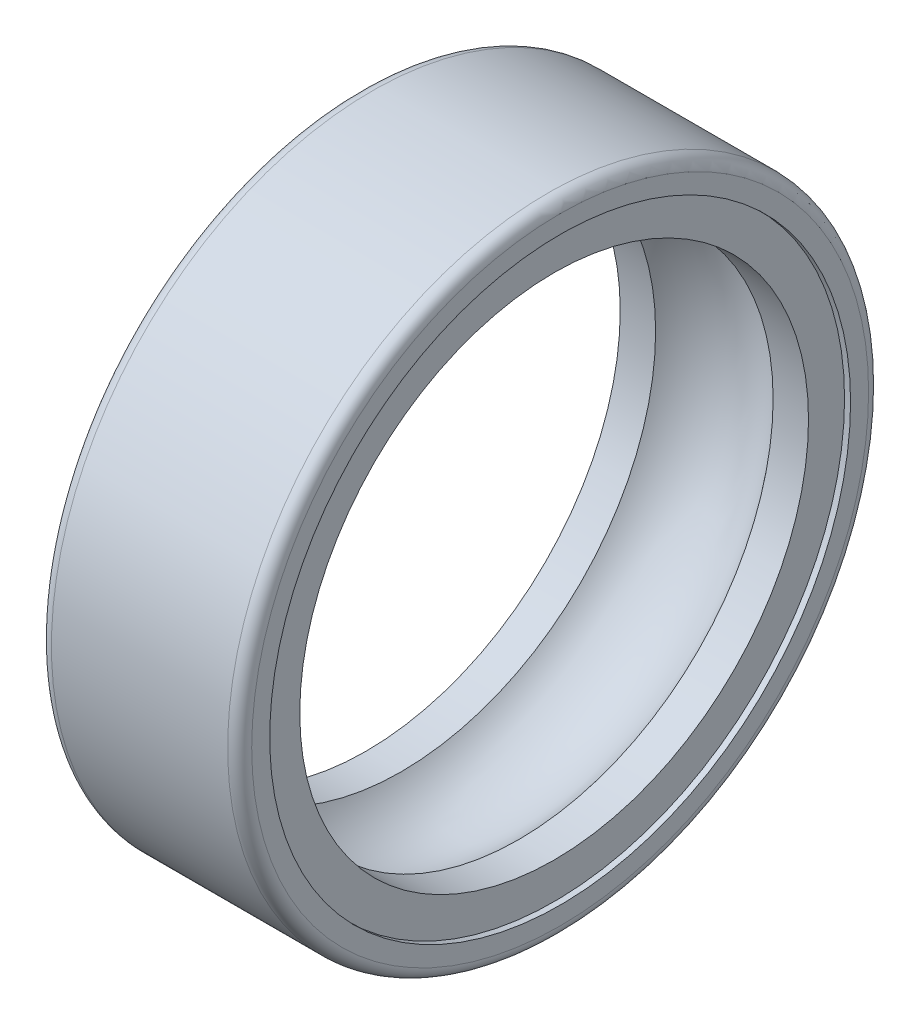
ISO-10303-21;
HEADER;
FILE_DESCRIPTION(('STEP AP214'),'2;1');
FILE_NAME('part.step','',(''),(''),'','','');
FILE_SCHEMA(('AUTOMOTIVE_DESIGN { 1 0 10303 214 1 1 1 1 }'));
ENDSEC;
DATA;
#1=APPLICATION_CONTEXT('core data for automotive mechanical design processes');
#2=APPLICATION_PROTOCOL_DEFINITION('international standard','automotive_design',2000,#1);
#3=PRODUCT_CONTEXT('',#1,'mechanical');
#4=PRODUCT('Part','Part','',(#3));
#5=PRODUCT_RELATED_PRODUCT_CATEGORY('part','',(#4));
#6=PRODUCT_DEFINITION_FORMATION('','',#4);
#7=PRODUCT_DEFINITION_CONTEXT('part definition',#1,'design');
#8=PRODUCT_DEFINITION('design','',#6,#7);
#9=PRODUCT_DEFINITION_SHAPE('','',#8);
#10=(LENGTH_UNIT() NAMED_UNIT(*) SI_UNIT(.MILLI.,.METRE.));
#11=(NAMED_UNIT(*) PLANE_ANGLE_UNIT() SI_UNIT($,.RADIAN.));
#12=(NAMED_UNIT(*) SI_UNIT($,.STERADIAN.) SOLID_ANGLE_UNIT());
#13=UNCERTAINTY_MEASURE_WITH_UNIT(LENGTH_MEASURE(1.E-05),#10,'distance_accuracy_value','');
#14=(GEOMETRIC_REPRESENTATION_CONTEXT(3) GLOBAL_UNCERTAINTY_ASSIGNED_CONTEXT((#13)) GLOBAL_UNIT_ASSIGNED_CONTEXT((#10,
#11,#12)) REPRESENTATION_CONTEXT('',''));
#15=CARTESIAN_POINT('',(0.,0.,0.));
#16=DIRECTION('',(0.,0.,1.));
#17=DIRECTION('',(1.,0.,0.));
#18=AXIS2_PLACEMENT_3D('',#15,#16,#17);
#19=CARTESIAN_POINT('',(-2.2,0.,0.));
#20=DIRECTION('',(1.,0.,0.));
#21=DIRECTION('',(0.,0.,-1.));
#22=AXIS2_PLACEMENT_3D('',#19,#20,#21);
#23=TOROIDAL_SURFACE('',#22,7.7,0.3);
#24=CARTESIAN_POINT('',(-2.5,0.,0.));
#25=DIRECTION('',(-1.,0.,0.));
#26=DIRECTION('',(0.,0.,-1.));
#27=AXIS2_PLACEMENT_3D('',#24,#25,#26);
#28=CIRCLE('',#27,7.7);
#29=CARTESIAN_POINT('',(-2.5,0.,-7.7));
#30=VERTEX_POINT('',#29);
#31=EDGE_CURVE('E31',#30,#30,#28,.T.);
#32=ORIENTED_EDGE('',*,*,#31,.F.);
#33=EDGE_LOOP('',(#32));
#34=FACE_BOUND('',#33,.T.);
#35=CARTESIAN_POINT('',(-2.2,0.,0.));
#36=DIRECTION('',(-1.,0.,0.));
#37=DIRECTION('',(0.,0.,-1.));
#38=AXIS2_PLACEMENT_3D('',#35,#36,#37);
#39=CIRCLE('',#38,8.);
#40=CARTESIAN_POINT('',(-2.2,0.,-8.));
#41=VERTEX_POINT('',#40);
#42=EDGE_CURVE('E10',#41,#41,#39,.T.);
#43=ORIENTED_EDGE('',*,*,#42,.T.);
#44=EDGE_LOOP('',(#43));
#45=FACE_BOUND('',#44,.T.);
#46=ADVANCED_FACE('F15',(#34,#45),#23,.T.);
#47=CARTESIAN_POINT('',(0.,0.,0.));
#48=DIRECTION('',(-1.,0.,0.));
#49=DIRECTION('',(0.,1.,0.));
#50=AXIS2_PLACEMENT_3D('',#47,#48,#49);
#51=CYLINDRICAL_SURFACE('',#50,8.);
#52=ORIENTED_EDGE('',*,*,#42,.F.);
#53=EDGE_LOOP('',(#52));
#54=FACE_BOUND('',#53,.T.);
#55=CARTESIAN_POINT('',(2.2,0.,0.));
#56=DIRECTION('',(1.,0.,0.));
#57=DIRECTION('',(0.,0.,-1.));
#58=AXIS2_PLACEMENT_3D('',#55,#56,#57);
#59=CIRCLE('',#58,8.);
#60=CARTESIAN_POINT('',(2.2,0.,-8.));
#61=VERTEX_POINT('',#60);
#62=EDGE_CURVE('E23',#61,#61,#59,.T.);
#63=ORIENTED_EDGE('',*,*,#62,.F.);
#64=EDGE_LOOP('',(#63));
#65=FACE_BOUND('',#64,.T.);
#66=ADVANCED_FACE('F73',(#54,#65),#51,.T.);
#67=CARTESIAN_POINT('',(2.2,0.,0.));
#68=DIRECTION('',(1.,0.,0.));
#69=DIRECTION('',(0.,0.,-1.));
#70=AXIS2_PLACEMENT_3D('',#67,#68,#69);
#71=TOROIDAL_SURFACE('',#70,7.7,0.3);
#72=ORIENTED_EDGE('',*,*,#62,.T.);
#73=EDGE_LOOP('',(#72));
#74=FACE_BOUND('',#73,.T.);
#75=CARTESIAN_POINT('',(2.5,0.,0.));
#76=DIRECTION('',(1.,0.,0.));
#77=DIRECTION('',(0.,1.,0.));
#78=AXIS2_PLACEMENT_3D('',#75,#76,#77);
#79=CIRCLE('',#78,7.7);
#80=CARTESIAN_POINT('',(2.5,7.7,0.));
#81=VERTEX_POINT('',#80);
#82=EDGE_CURVE('E28',#81,#81,#79,.T.);
#83=ORIENTED_EDGE('',*,*,#82,.F.);
#84=EDGE_LOOP('',(#83));
#85=FACE_BOUND('',#84,.T.);
#86=ADVANCED_FACE('F79',(#74,#85),#71,.T.);
#87=CARTESIAN_POINT('',(2.5,7.025,0.));
#88=DIRECTION('',(1.,0.,0.));
#89=DIRECTION('',(0.,1.,0.));
#90=AXIS2_PLACEMENT_3D('',#87,#88,#89);
#91=PLANE('',#90);
#92=ORIENTED_EDGE('',*,*,#82,.T.);
#93=EDGE_LOOP('',(#92));
#94=FACE_BOUND('',#93,.T.);
#95=CARTESIAN_POINT('',(2.5,0.,0.));
#96=DIRECTION('',(-1.,0.,0.));
#97=DIRECTION('',(0.,0.,-1.));
#98=AXIS2_PLACEMENT_3D('',#95,#96,#97);
#99=CIRCLE('',#98,7.25);
#100=CARTESIAN_POINT('',(2.5,0.,-7.25));
#101=VERTEX_POINT('',#100);
#102=EDGE_CURVE('E37',#101,#101,#99,.T.);
#103=ORIENTED_EDGE('',*,*,#102,.T.);
#104=EDGE_LOOP('',(#103));
#105=FACE_BOUND('',#104,.T.);
#106=ADVANCED_FACE('F86',(#94,#105),#91,.T.);
#107=CARTESIAN_POINT('',(2.925,0.,0.));
#108=DIRECTION('',(-1.,0.,0.));
#109=DIRECTION('',(0.,0.,-1.));
#110=AXIS2_PLACEMENT_3D('',#107,#108,#109);
#111=CYLINDRICAL_SURFACE('',#110,7.25);
#112=ORIENTED_EDGE('',*,*,#102,.F.);
#113=EDGE_LOOP('',(#112));
#114=FACE_BOUND('',#113,.T.);
#115=CARTESIAN_POINT('',(2.35,0.,0.));
#116=DIRECTION('',(1.,0.,0.));
#117=DIRECTION('',(0.,0.,-1.));
#118=AXIS2_PLACEMENT_3D('',#115,#116,#117);
#119=CIRCLE('',#118,7.25);
#120=CARTESIAN_POINT('',(2.35,0.,-7.25));
#121=VERTEX_POINT('',#120);
#122=EDGE_CURVE('E40',#121,#121,#119,.T.);
#123=ORIENTED_EDGE('',*,*,#122,.F.);
#124=EDGE_LOOP('',(#123));
#125=FACE_BOUND('',#124,.T.);
#126=ADVANCED_FACE('F90',(#114,#125),#111,.F.);
#127=CARTESIAN_POINT('',(2.35,0.,0.));
#128=DIRECTION('',(-1.,0.,0.));
#129=DIRECTION('',(0.,0.,1.));
#130=AXIS2_PLACEMENT_3D('',#127,#128,#129);
#131=PLANE('',#130);
#132=ORIENTED_EDGE('',*,*,#122,.T.);
#133=EDGE_LOOP('',(#132));
#134=FACE_BOUND('',#133,.T.);
#135=CARTESIAN_POINT('',(2.35,0.,0.));
#136=DIRECTION('',(-1.,0.,0.));
#137=DIRECTION('',(0.,-1.,0.));
#138=AXIS2_PLACEMENT_3D('',#135,#136,#137);
#139=CIRCLE('',#138,6.35);
#140=CARTESIAN_POINT('',(2.35,-6.35,0.));
#141=VERTEX_POINT('',#140);
#142=EDGE_CURVE('E43',#141,#141,#139,.T.);
#143=ORIENTED_EDGE('',*,*,#142,.T.);
#144=EDGE_LOOP('',(#143));
#145=FACE_BOUND('',#144,.T.);
#146=ADVANCED_FACE('F94',(#134,#145),#131,.F.);
#147=CARTESIAN_POINT('',(0.,0.,0.));
#148=DIRECTION('',(-1.,0.,0.));
#149=DIRECTION('',(0.,1.,0.));
#150=AXIS2_PLACEMENT_3D('',#147,#148,#149);
#151=CYLINDRICAL_SURFACE('',#150,6.35);
#152=CARTESIAN_POINT('',(1.466666666667,0.,0.));
#153=DIRECTION('',(1.,0.,0.));
#154=DIRECTION('',(0.,0.,-1.));
#155=AXIS2_PLACEMENT_3D('',#152,#153,#154);
#156=CIRCLE('',#155,6.35);
#157=CARTESIAN_POINT('',(1.466666666667,0.,-6.35));
#158=VERTEX_POINT('',#157);
#159=EDGE_CURVE('E46',#158,#158,#156,.T.);
#160=ORIENTED_EDGE('',*,*,#159,.F.);
#161=EDGE_LOOP('',(#160));
#162=FACE_BOUND('',#161,.T.);
#163=ORIENTED_EDGE('',*,*,#142,.F.);
#164=EDGE_LOOP('',(#163));
#165=FACE_BOUND('',#164,.T.);
#166=ADVANCED_FACE('F98',(#162,#165),#151,.F.);
#167=CARTESIAN_POINT('',(0.,0.,0.));
#168=DIRECTION('',(1.,0.,0.));
#169=DIRECTION('',(0.,0.,-1.));
#170=AXIS2_PLACEMENT_3D('',#167,#168,#169);
#171=TOROIDAL_SURFACE('',#170,5.25,1.833333333333);
#172=ORIENTED_EDGE('',*,*,#159,.T.);
#173=EDGE_LOOP('',(#172));
#174=FACE_BOUND('',#173,.T.);
#175=CARTESIAN_POINT('',(-1.466666666667,0.,0.));
#176=DIRECTION('',(-1.,0.,0.));
#177=DIRECTION('',(0.,0.,1.));
#178=AXIS2_PLACEMENT_3D('',#175,#176,#177);
#179=CIRCLE('',#178,6.35);
#180=CARTESIAN_POINT('',(-1.466666666667,0.,6.35));
#181=VERTEX_POINT('',#180);
#182=EDGE_CURVE('E49',#181,#181,#179,.T.);
#183=ORIENTED_EDGE('',*,*,#182,.T.);
#184=EDGE_LOOP('',(#183));
#185=FACE_BOUND('',#184,.T.);
#186=ADVANCED_FACE('F102',(#174,#185),#171,.F.);
#187=CARTESIAN_POINT('',(0.,0.,0.));
#188=DIRECTION('',(-1.,0.,0.));
#189=DIRECTION('',(0.,1.,0.));
#190=AXIS2_PLACEMENT_3D('',#187,#188,#189);
#191=CYLINDRICAL_SURFACE('',#190,6.35);
#192=CARTESIAN_POINT('',(-2.35,0.,0.));
#193=DIRECTION('',(1.,0.,0.));
#194=DIRECTION('',(0.,1.,0.));
#195=AXIS2_PLACEMENT_3D('',#192,#193,#194);
#196=CIRCLE('',#195,6.35);
#197=CARTESIAN_POINT('',(-2.35,6.35,0.));
#198=VERTEX_POINT('',#197);
#199=EDGE_CURVE('E33',#198,#198,#196,.T.);
#200=ORIENTED_EDGE('',*,*,#199,.F.);
#201=EDGE_LOOP('',(#200));
#202=FACE_BOUND('',#201,.T.);
#203=ORIENTED_EDGE('',*,*,#182,.F.);
#204=EDGE_LOOP('',(#203));
#205=FACE_BOUND('',#204,.T.);
#206=ADVANCED_FACE('F69',(#202,#205),#191,.F.);
#207=CARTESIAN_POINT('',(-2.35,0.,0.));
#208=DIRECTION('',(1.,0.,0.));
#209=DIRECTION('',(0.,0.,-1.));
#210=AXIS2_PLACEMENT_3D('',#207,#208,#209);
#211=PLANE('',#210);
#212=CARTESIAN_POINT('',(-2.35,0.,0.));
#213=DIRECTION('',(-1.,0.,0.));
#214=DIRECTION('',(0.,0.,1.));
#215=AXIS2_PLACEMENT_3D('',#212,#213,#214);
#216=CIRCLE('',#215,7.25);
#217=CARTESIAN_POINT('',(-2.35,0.,7.25));
#218=VERTEX_POINT('',#217);
#219=EDGE_CURVE('E52',#218,#218,#216,.T.);
#220=ORIENTED_EDGE('',*,*,#219,.T.);
#221=EDGE_LOOP('',(#220));
#222=FACE_BOUND('',#221,.T.);
#223=ORIENTED_EDGE('',*,*,#199,.T.);
#224=EDGE_LOOP('',(#223));
#225=FACE_BOUND('',#224,.T.);
#226=ADVANCED_FACE('F57',(#222,#225),#211,.F.);
#227=CARTESIAN_POINT('',(-2.925,0.,0.));
#228=DIRECTION('',(1.,0.,0.));
#229=DIRECTION('',(0.,0.,1.));
#230=AXIS2_PLACEMENT_3D('',#227,#228,#229);
#231=CYLINDRICAL_SURFACE('',#230,7.25);
#232=CARTESIAN_POINT('',(-2.5,0.,0.));
#233=DIRECTION('',(1.,0.,0.));
#234=DIRECTION('',(0.,0.,1.));
#235=AXIS2_PLACEMENT_3D('',#232,#233,#234);
#236=CIRCLE('',#235,7.25);
#237=CARTESIAN_POINT('',(-2.5,0.,7.25));
#238=VERTEX_POINT('',#237);
#239=EDGE_CURVE('E19',#238,#238,#236,.T.);
#240=ORIENTED_EDGE('',*,*,#239,.F.);
#241=EDGE_LOOP('',(#240));
#242=FACE_BOUND('',#241,.T.);
#243=ORIENTED_EDGE('',*,*,#219,.F.);
#244=EDGE_LOOP('',(#243));
#245=FACE_BOUND('',#244,.T.);
#246=ADVANCED_FACE('F60',(#242,#245),#231,.F.);
#247=CARTESIAN_POINT('',(-2.5,7.025,0.));
#248=DIRECTION('',(-1.,0.,0.));
#249=DIRECTION('',(0.,-1.,0.));
#250=AXIS2_PLACEMENT_3D('',#247,#248,#249);
#251=PLANE('',#250);
#252=ORIENTED_EDGE('',*,*,#31,.T.);
#253=EDGE_LOOP('',(#252));
#254=FACE_BOUND('',#253,.T.);
#255=ORIENTED_EDGE('',*,*,#239,.T.);
#256=EDGE_LOOP('',(#255));
#257=FACE_BOUND('',#256,.T.);
#258=ADVANCED_FACE('F17',(#254,#257),#251,.T.);
#259=CLOSED_SHELL('',(#46,#66,#86,#106,#126,#146,#166,#186,#206,#226,#246,#258));
#260=MANIFOLD_SOLID_BREP('B1',#259);
#261=ADVANCED_BREP_SHAPE_REPRESENTATION('',(#18,#260),#14);
#262=SHAPE_DEFINITION_REPRESENTATION(#9,#261);
ENDSEC;
END-ISO-10303-21;
